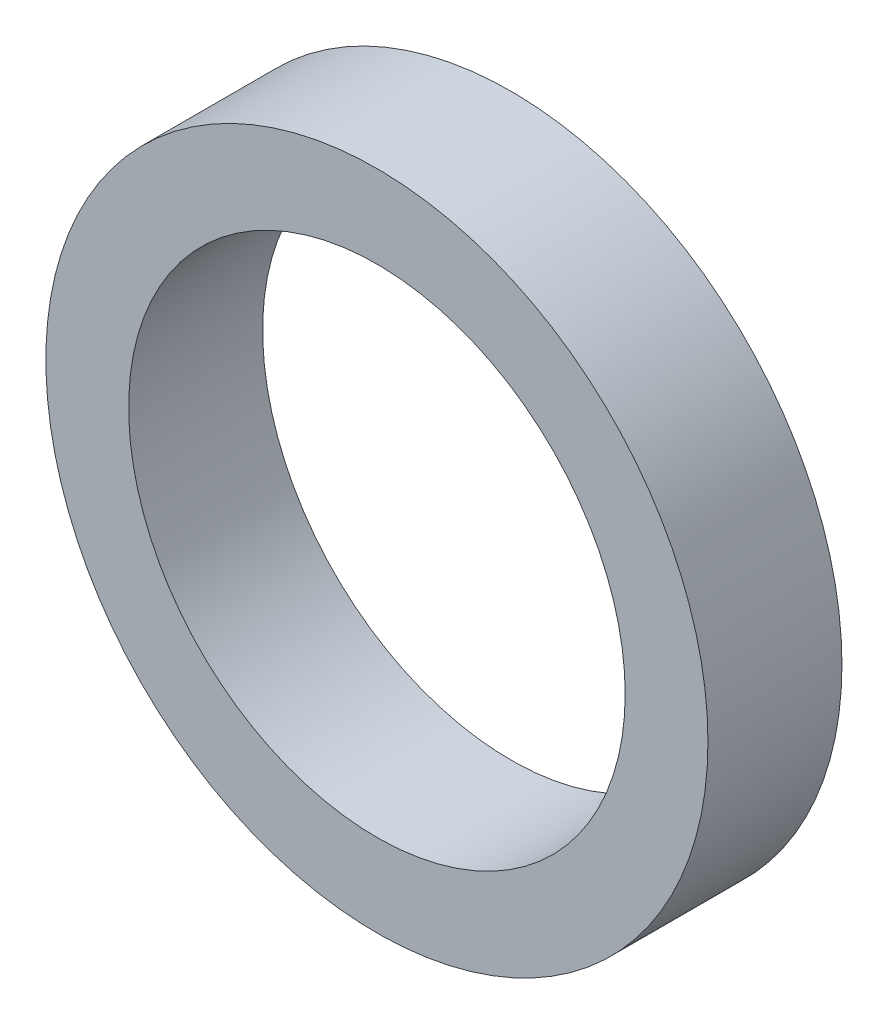
ISO-10303-21;
HEADER;
FILE_DESCRIPTION(('STEP AP214'),'2;1');
FILE_NAME('part.step','',(''),(''),'','','');
FILE_SCHEMA(('AUTOMOTIVE_DESIGN { 1 0 10303 214 1 1 1 1 }'));
ENDSEC;
DATA;
#1=APPLICATION_CONTEXT('core data for automotive mechanical design processes');
#2=APPLICATION_PROTOCOL_DEFINITION('international standard','automotive_design',2000,#1);
#3=PRODUCT_CONTEXT('',#1,'mechanical');
#4=PRODUCT('Part','Part','',(#3));
#5=PRODUCT_RELATED_PRODUCT_CATEGORY('part','',(#4));
#6=PRODUCT_DEFINITION_FORMATION('','',#4);
#7=PRODUCT_DEFINITION_CONTEXT('part definition',#1,'design');
#8=PRODUCT_DEFINITION('design','',#6,#7);
#9=PRODUCT_DEFINITION_SHAPE('','',#8);
#10=(LENGTH_UNIT() NAMED_UNIT(*) SI_UNIT(.MILLI.,.METRE.));
#11=(NAMED_UNIT(*) PLANE_ANGLE_UNIT() SI_UNIT($,.RADIAN.));
#12=(NAMED_UNIT(*) SI_UNIT($,.STERADIAN.) SOLID_ANGLE_UNIT());
#13=UNCERTAINTY_MEASURE_WITH_UNIT(LENGTH_MEASURE(1.E-05),#10,'distance_accuracy_value','');
#14=(GEOMETRIC_REPRESENTATION_CONTEXT(3) GLOBAL_UNCERTAINTY_ASSIGNED_CONTEXT((#13)) GLOBAL_UNIT_ASSIGNED_CONTEXT((#10,
#11,#12)) REPRESENTATION_CONTEXT('',''));
#15=CARTESIAN_POINT('',(0.,0.,0.));
#16=DIRECTION('',(0.,0.,1.));
#17=DIRECTION('',(1.,0.,0.));
#18=AXIS2_PLACEMENT_3D('',#15,#16,#17);
#19=CARTESIAN_POINT('',(0.,0.,1.7));
#20=DIRECTION('',(0.,0.,1.));
#21=DIRECTION('',(1.,0.,0.));
#22=AXIS2_PLACEMENT_3D('',#19,#20,#21);
#23=PLANE('',#22);
#24=CARTESIAN_POINT('',(0.,0.,1.7));
#25=DIRECTION('',(0.,0.,1.));
#26=DIRECTION('',(1.,0.,0.));
#27=AXIS2_PLACEMENT_3D('',#24,#25,#26);
#28=CIRCLE('',#27,4.2);
#29=CARTESIAN_POINT('',(4.2,0.,1.7));
#30=VERTEX_POINT('',#29);
#31=EDGE_CURVE('E10',#30,#30,#28,.T.);
#32=ORIENTED_EDGE('',*,*,#31,.T.);
#33=EDGE_LOOP('',(#32));
#34=FACE_BOUND('',#33,.T.);
#35=CARTESIAN_POINT('',(0.,0.,1.7));
#36=DIRECTION('',(0.,0.,1.));
#37=DIRECTION('',(1.,0.,0.));
#38=AXIS2_PLACEMENT_3D('',#35,#36,#37);
#39=CIRCLE('',#38,3.15);
#40=CARTESIAN_POINT('',(3.15,0.,1.7));
#41=VERTEX_POINT('',#40);
#42=EDGE_CURVE('E48',#41,#41,#39,.T.);
#43=ORIENTED_EDGE('',*,*,#42,.F.);
#44=EDGE_LOOP('',(#43));
#45=FACE_BOUND('',#44,.T.);
#46=ADVANCED_FACE('F40',(#34,#45),#23,.T.);
#47=CARTESIAN_POINT('',(0.,0.,0.));
#48=DIRECTION('',(0.,0.,1.));
#49=DIRECTION('',(1.,0.,0.));
#50=AXIS2_PLACEMENT_3D('',#47,#48,#49);
#51=PLANE('',#50);
#52=CARTESIAN_POINT('',(0.,0.,0.));
#53=DIRECTION('',(0.,0.,1.));
#54=DIRECTION('',(1.,0.,0.));
#55=AXIS2_PLACEMENT_3D('',#52,#53,#54);
#56=CIRCLE('',#55,4.2);
#57=CARTESIAN_POINT('',(4.2,0.,0.));
#58=VERTEX_POINT('',#57);
#59=EDGE_CURVE('E41',#58,#58,#56,.T.);
#60=ORIENTED_EDGE('',*,*,#59,.F.);
#61=EDGE_LOOP('',(#60));
#62=FACE_BOUND('',#61,.T.);
#63=CARTESIAN_POINT('',(0.,0.,0.));
#64=DIRECTION('',(0.,0.,1.));
#65=DIRECTION('',(1.,0.,0.));
#66=AXIS2_PLACEMENT_3D('',#63,#64,#65);
#67=CIRCLE('',#66,3.15);
#68=CARTESIAN_POINT('',(3.15,0.,0.));
#69=VERTEX_POINT('',#68);
#70=EDGE_CURVE('E49',#69,#69,#67,.T.);
#71=ORIENTED_EDGE('',*,*,#70,.T.);
#72=EDGE_LOOP('',(#71));
#73=FACE_BOUND('',#72,.T.);
#74=ADVANCED_FACE('F58',(#62,#73),#51,.F.);
#75=CARTESIAN_POINT('',(0.,0.,1.7));
#76=DIRECTION('',(0.,0.,-1.));
#77=DIRECTION('',(-1.,0.,0.));
#78=AXIS2_PLACEMENT_3D('',#75,#76,#77);
#79=CYLINDRICAL_SURFACE('',#78,4.2);
#80=ORIENTED_EDGE('',*,*,#31,.F.);
#81=EDGE_LOOP('',(#80));
#82=FACE_BOUND('',#81,.T.);
#83=ORIENTED_EDGE('',*,*,#59,.T.);
#84=EDGE_LOOP('',(#83));
#85=FACE_BOUND('',#84,.T.);
#86=ADVANCED_FACE('F39',(#82,#85),#79,.T.);
#87=CARTESIAN_POINT('',(0.,0.,1.7));
#88=DIRECTION('',(0.,0.,-1.));
#89=DIRECTION('',(-1.,0.,0.));
#90=AXIS2_PLACEMENT_3D('',#87,#88,#89);
#91=CYLINDRICAL_SURFACE('',#90,3.15);
#92=ORIENTED_EDGE('',*,*,#42,.T.);
#93=EDGE_LOOP('',(#92));
#94=FACE_BOUND('',#93,.T.);
#95=ORIENTED_EDGE('',*,*,#70,.F.);
#96=EDGE_LOOP('',(#95));
#97=FACE_BOUND('',#96,.T.);
#98=ADVANCED_FACE('F57',(#94,#97),#91,.F.);
#99=CLOSED_SHELL('',(#46,#74,#86,#98));
#100=MANIFOLD_SOLID_BREP('B2',#99);
#101=ADVANCED_BREP_SHAPE_REPRESENTATION('',(#18,#100),#14);
#102=SHAPE_DEFINITION_REPRESENTATION(#9,#101);
ENDSEC;
END-ISO-10303-21;
